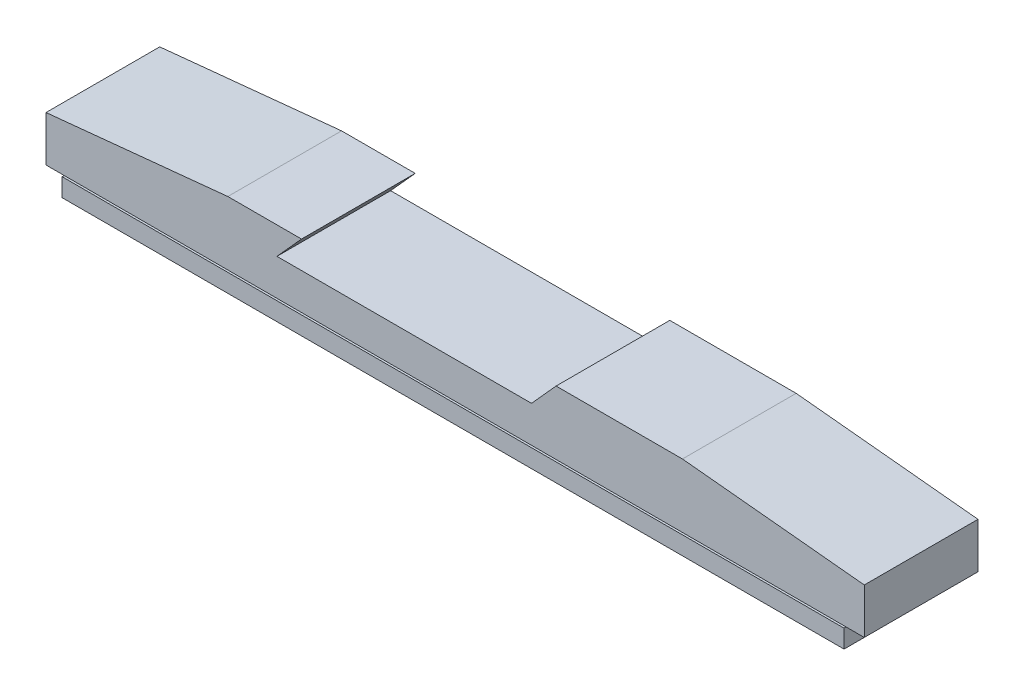
ISO-10303-21;
HEADER;
FILE_DESCRIPTION(('STEP AP214'),'2;1');
FILE_NAME('part.step','',(''),(''),'','','');
FILE_SCHEMA(('AUTOMOTIVE_DESIGN { 1 0 10303 214 1 1 1 1 }'));
ENDSEC;
DATA;
#1=APPLICATION_CONTEXT('core data for automotive mechanical design processes');
#2=APPLICATION_PROTOCOL_DEFINITION('international standard','automotive_design',2000,#1);
#3=PRODUCT_CONTEXT('',#1,'mechanical');
#4=PRODUCT('Part','Part','',(#3));
#5=PRODUCT_RELATED_PRODUCT_CATEGORY('part','',(#4));
#6=PRODUCT_DEFINITION_FORMATION('','',#4);
#7=PRODUCT_DEFINITION_CONTEXT('part definition',#1,'design');
#8=PRODUCT_DEFINITION('design','',#6,#7);
#9=PRODUCT_DEFINITION_SHAPE('','',#8);
#10=(LENGTH_UNIT() NAMED_UNIT(*) SI_UNIT(.MILLI.,.METRE.));
#11=(NAMED_UNIT(*) PLANE_ANGLE_UNIT() SI_UNIT($,.RADIAN.));
#12=(NAMED_UNIT(*) SI_UNIT($,.STERADIAN.) SOLID_ANGLE_UNIT());
#13=UNCERTAINTY_MEASURE_WITH_UNIT(LENGTH_MEASURE(1.E-05),#10,'distance_accuracy_value','');
#14=(GEOMETRIC_REPRESENTATION_CONTEXT(3) GLOBAL_UNCERTAINTY_ASSIGNED_CONTEXT((#13)) GLOBAL_UNIT_ASSIGNED_CONTEXT((#10,
#11,#12)) REPRESENTATION_CONTEXT('',''));
#15=CARTESIAN_POINT('',(0.,0.,0.));
#16=DIRECTION('',(0.,0.,1.));
#17=DIRECTION('',(1.,0.,0.));
#18=AXIS2_PLACEMENT_3D('',#15,#16,#17);
#19=CARTESIAN_POINT('',(0.,0.,0.));
#20=DIRECTION('',(1.,0.,0.));
#21=DIRECTION('',(0.,0.,-1.));
#22=AXIS2_PLACEMENT_3D('',#19,#20,#21);
#23=PLANE('',#22);
#24=DIRECTION('',(0.,0.,1.));
#25=VECTOR('',#24,1.);
#26=CARTESIAN_POINT('',(0.,25.,-31.2676666666667));
#27=LINE('',#26,#25);
#28=CARTESIAN_POINT('',(0.,25.,-31.2666666666667));
#29=VERTEX_POINT('',#28);
#30=CARTESIAN_POINT('',(0.,25.,31.2666666666667));
#31=VERTEX_POINT('',#30);
#32=EDGE_CURVE('E173',#29,#31,#27,.T.);
#33=ORIENTED_EDGE('',*,*,#32,.F.);
#34=DIRECTION('',(0.,-1.,0.));
#35=VECTOR('',#34,1.);
#36=CARTESIAN_POINT('',(0.,0.,-31.2666666666667));
#37=LINE('',#36,#35);
#38=CARTESIAN_POINT('',(0.,0.,-31.2666666666667));
#39=VERTEX_POINT('',#38);
#40=EDGE_CURVE('E183',#29,#39,#37,.T.);
#41=ORIENTED_EDGE('',*,*,#40,.T.);
#42=DIRECTION('',(0.,0.,-1.));
#43=VECTOR('',#42,1.);
#44=CARTESIAN_POINT('',(0.,0.,0.));
#45=LINE('',#44,#43);
#46=CARTESIAN_POINT('',(0.,0.,-11.6666666666667));
#47=VERTEX_POINT('',#46);
#48=EDGE_CURVE('E287',#47,#39,#45,.T.);
#49=ORIENTED_EDGE('',*,*,#48,.F.);
#50=DIRECTION('',(0.,-1.,0.));
#51=VECTOR('',#50,1.);
#52=CARTESIAN_POINT('',(0.,0.,-11.6666666666667));
#53=LINE('',#52,#51);
#54=CARTESIAN_POINT('',(0.,-10.,-11.6666666666667));
#55=VERTEX_POINT('',#54);
#56=EDGE_CURVE('E206',#47,#55,#53,.T.);
#57=ORIENTED_EDGE('',*,*,#56,.T.);
#58=DIRECTION('',(0.,0.,-1.));
#59=VECTOR('',#58,1.);
#60=CARTESIAN_POINT('',(0.,-10.,0.));
#61=LINE('',#60,#59);
#62=CARTESIAN_POINT('',(0.,-9.99999999999999,-22.4));
#63=VERTEX_POINT('',#62);
#64=EDGE_CURVE('E236',#55,#63,#61,.T.);
#65=ORIENTED_EDGE('',*,*,#64,.T.);
#66=DIRECTION('',(0.,-1.,0.));
#67=VECTOR('',#66,1.);
#68=CARTESIAN_POINT('',(0.,0.,-22.4));
#69=LINE('',#68,#67);
#70=CARTESIAN_POINT('',(0.,-20.,-22.4));
#71=VERTEX_POINT('',#70);
#72=EDGE_CURVE('E232',#63,#71,#69,.T.);
#73=ORIENTED_EDGE('',*,*,#72,.T.);
#74=DIRECTION('',(0.,0.,-1.));
#75=VECTOR('',#74,1.);
#76=CARTESIAN_POINT('',(0.,-20.,0.));
#77=LINE('',#76,#75);
#78=CARTESIAN_POINT('',(0.,-20.,22.4));
#79=VERTEX_POINT('',#78);
#80=EDGE_CURVE('E231',#79,#71,#77,.T.);
#81=ORIENTED_EDGE('',*,*,#80,.F.);
#82=DIRECTION('',(0.,-1.,0.));
#83=VECTOR('',#82,1.);
#84=CARTESIAN_POINT('',(0.,0.,22.4));
#85=LINE('',#84,#83);
#86=CARTESIAN_POINT('',(0.,-10.,22.4));
#87=VERTEX_POINT('',#86);
#88=EDGE_CURVE('E228',#87,#79,#85,.T.);
#89=ORIENTED_EDGE('',*,*,#88,.F.);
#90=DIRECTION('',(0.,0.,-1.));
#91=VECTOR('',#90,1.);
#92=CARTESIAN_POINT('',(0.,-10.,0.));
#93=LINE('',#92,#91);
#94=CARTESIAN_POINT('',(0.,-10.,11.6666666666667));
#95=VERTEX_POINT('',#94);
#96=EDGE_CURVE('E230',#87,#95,#93,.T.);
#97=ORIENTED_EDGE('',*,*,#96,.T.);
#98=DIRECTION('',(0.,-1.,0.));
#99=VECTOR('',#98,1.);
#100=CARTESIAN_POINT('',(0.,0.,11.6666666666667));
#101=LINE('',#100,#99);
#102=CARTESIAN_POINT('',(0.,0.,11.6666666666667));
#103=VERTEX_POINT('',#102);
#104=EDGE_CURVE('E203',#103,#95,#101,.T.);
#105=ORIENTED_EDGE('',*,*,#104,.F.);
#106=CARTESIAN_POINT('',(0.,0.,31.2666666666667));
#107=VERTEX_POINT('',#106);
#108=EDGE_CURVE('E283',#107,#103,#45,.T.);
#109=ORIENTED_EDGE('',*,*,#108,.F.);
#110=DIRECTION('',(0.,-1.,0.));
#111=VECTOR('',#110,1.);
#112=CARTESIAN_POINT('',(0.,0.,31.2666666666667));
#113=LINE('',#112,#111);
#114=EDGE_CURVE('E295',#31,#107,#113,.T.);
#115=ORIENTED_EDGE('',*,*,#114,.F.);
#116=EDGE_LOOP('',(#33,#41,#49,#57,#65,#73,#81,#89,#97,#105,#109,#115));
#117=FACE_BOUND('',#116,.T.);
#118=ADVANCED_FACE('F37',(#117),#23,.F.);
#119=CARTESIAN_POINT('',(450.,35.,0.));
#120=DIRECTION('',(0.,1.,0.));
#121=DIRECTION('',(0.,0.,1.));
#122=AXIS2_PLACEMENT_3D('',#119,#120,#121);
#123=PLANE('',#122);
#124=DIRECTION('',(-1.,0.,0.));
#125=VECTOR('',#124,1.);
#126=CARTESIAN_POINT('',(450.,35.,-31.2666666666667));
#127=LINE('',#126,#125);
#128=CARTESIAN_POINT('',(140.506060664468,35.,-31.2666666666667));
#129=VERTEX_POINT('',#128);
#130=CARTESIAN_POINT('',(100.,35.,-31.2666666666667));
#131=VERTEX_POINT('',#130);
#132=EDGE_CURVE('E181',#129,#131,#127,.T.);
#133=ORIENTED_EDGE('',*,*,#132,.T.);
#134=DIRECTION('',(0.,0.,1.));
#135=VECTOR('',#134,1.);
#136=CARTESIAN_POINT('',(100.,35.,-31.2676666666667));
#137=LINE('',#136,#135);
#138=CARTESIAN_POINT('',(100.,35.,31.2666666666667));
#139=VERTEX_POINT('',#138);
#140=EDGE_CURVE('E163',#131,#139,#137,.T.);
#141=ORIENTED_EDGE('',*,*,#140,.T.);
#142=DIRECTION('',(-1.,0.,0.));
#143=VECTOR('',#142,1.);
#144=CARTESIAN_POINT('',(450.,35.,31.2666666666667));
#145=LINE('',#144,#143);
#146=CARTESIAN_POINT('',(140.506060664468,35.,31.2666666666667));
#147=VERTEX_POINT('',#146);
#148=EDGE_CURVE('E198',#147,#139,#145,.T.);
#149=ORIENTED_EDGE('',*,*,#148,.F.);
#150=DIRECTION('',(0.,0.,1.));
#151=VECTOR('',#150,1.);
#152=CARTESIAN_POINT('',(140.506060664468,35.,-31.2676666666667));
#153=LINE('',#152,#151);
#154=EDGE_CURVE('E186',#129,#147,#153,.T.);
#155=ORIENTED_EDGE('',*,*,#154,.F.);
#156=EDGE_LOOP('',(#133,#141,#149,#155));
#157=FACE_BOUND('',#156,.T.);
#158=ADVANCED_FACE('F189',(#157),#123,.T.);
#159=DIRECTION('',(0.,0.,1.));
#160=VECTOR('',#159,1.);
#161=CARTESIAN_POINT('',(350.,35.,-31.2676666666667));
#162=LINE('',#161,#160);
#163=CARTESIAN_POINT('',(350.,35.,-31.2666666666667));
#164=VERTEX_POINT('',#163);
#165=CARTESIAN_POINT('',(350.,35.,31.2666666666667));
#166=VERTEX_POINT('',#165);
#167=EDGE_CURVE('E332',#164,#166,#162,.T.);
#168=ORIENTED_EDGE('',*,*,#167,.F.);
#169=CARTESIAN_POINT('',(280.506060664468,35.,-31.2666666666667));
#170=VERTEX_POINT('',#169);
#171=EDGE_CURVE('E188',#164,#170,#127,.T.);
#172=ORIENTED_EDGE('',*,*,#171,.T.);
#173=DIRECTION('',(0.,0.,1.));
#174=VECTOR('',#173,1.);
#175=CARTESIAN_POINT('',(280.506060664468,35.,-31.2676666666667));
#176=LINE('',#175,#174);
#177=CARTESIAN_POINT('',(280.506060664468,35.,31.2666666666667));
#178=VERTEX_POINT('',#177);
#179=EDGE_CURVE('E314',#170,#178,#176,.T.);
#180=ORIENTED_EDGE('',*,*,#179,.T.);
#181=EDGE_CURVE('E194',#166,#178,#145,.T.);
#182=ORIENTED_EDGE('',*,*,#181,.F.);
#183=EDGE_LOOP('',(#168,#172,#180,#182));
#184=FACE_BOUND('',#183,.T.);
#185=ADVANCED_FACE('F349',(#184),#123,.T.);
#186=CARTESIAN_POINT('',(450.,0.,0.));
#187=DIRECTION('',(1.,0.,0.));
#188=DIRECTION('',(0.,0.,-1.));
#189=AXIS2_PLACEMENT_3D('',#186,#187,#188);
#190=PLANE('',#189);
#191=DIRECTION('',(0.,-1.,0.));
#192=VECTOR('',#191,1.);
#193=CARTESIAN_POINT('',(450.,0.,-31.2666666666667));
#194=LINE('',#193,#192);
#195=CARTESIAN_POINT('',(450.,25.,-31.2666666666667));
#196=VERTEX_POINT('',#195);
#197=CARTESIAN_POINT('',(450.,0.,-31.2666666666667));
#198=VERTEX_POINT('',#197);
#199=EDGE_CURVE('E304',#196,#198,#194,.T.);
#200=ORIENTED_EDGE('',*,*,#199,.F.);
#201=DIRECTION('',(0.,0.,1.));
#202=VECTOR('',#201,1.);
#203=CARTESIAN_POINT('',(450.,25.,-31.2676666666667));
#204=LINE('',#203,#202);
#205=CARTESIAN_POINT('',(450.,25.,31.2666666666667));
#206=VERTEX_POINT('',#205);
#207=EDGE_CURVE('E335',#196,#206,#204,.T.);
#208=ORIENTED_EDGE('',*,*,#207,.T.);
#209=DIRECTION('',(0.,-1.,0.));
#210=VECTOR('',#209,1.);
#211=CARTESIAN_POINT('',(450.,0.,31.2666666666667));
#212=LINE('',#211,#210);
#213=CARTESIAN_POINT('',(450.,0.,31.2666666666667));
#214=VERTEX_POINT('',#213);
#215=EDGE_CURVE('E300',#206,#214,#212,.T.);
#216=ORIENTED_EDGE('',*,*,#215,.T.);
#217=DIRECTION('',(0.,0.,-1.));
#218=VECTOR('',#217,1.);
#219=CARTESIAN_POINT('',(450.,0.,0.));
#220=LINE('',#219,#218);
#221=EDGE_CURVE('E298',#214,#198,#220,.T.);
#222=ORIENTED_EDGE('',*,*,#221,.T.);
#223=EDGE_LOOP('',(#200,#208,#216,#222));
#224=FACE_BOUND('',#223,.T.);
#225=ADVANCED_FACE('F354',(#224),#190,.T.);
#226=CARTESIAN_POINT('',(450.,0.,-31.2666666666667));
#227=DIRECTION('',(0.,0.,-1.));
#228=DIRECTION('',(-1.,0.,0.));
#229=AXIS2_PLACEMENT_3D('',#226,#227,#228);
#230=PLANE('',#229);
#231=ORIENTED_EDGE('',*,*,#171,.F.);
#232=DIRECTION('',(0.995037190209989,-0.0995037190209991,0.));
#233=VECTOR('',#232,1.);
#234=CARTESIAN_POINT('',(6.93069306930695,69.3069306930694,-31.2666666666667));
#235=LINE('',#234,#233);
#236=EDGE_CURVE('E331',#164,#196,#235,.T.);
#237=ORIENTED_EDGE('',*,*,#236,.T.);
#238=ORIENTED_EDGE('',*,*,#199,.T.);
#239=DIRECTION('',(-1.,0.,0.));
#240=VECTOR('',#239,1.);
#241=CARTESIAN_POINT('',(450.,0.,-31.2666666666667));
#242=LINE('',#241,#240);
#243=EDGE_CURVE('E193',#198,#39,#242,.T.);
#244=ORIENTED_EDGE('',*,*,#243,.T.);
#245=ORIENTED_EDGE('',*,*,#40,.F.);
#246=DIRECTION('',(0.995037190209989,0.0995037190209991,0.));
#247=VECTOR('',#246,1.);
#248=CARTESIAN_POINT('',(-2.47524752475248,24.7524752475248,-31.2666666666667));
#249=LINE('',#248,#247);
#250=EDGE_CURVE('E170',#29,#131,#249,.T.);
#251=ORIENTED_EDGE('',*,*,#250,.T.);
#252=ORIENTED_EDGE('',*,*,#132,.F.);
#253=DIRECTION('',(-0.669130606358862,-0.743144825477391,0.));
#254=VECTOR('',#253,1.);
#255=CARTESIAN_POINT('',(60.1923384638127,-54.1974249885619,-31.2666666666667));
#256=LINE('',#255,#254);
#257=CARTESIAN_POINT('',(127.,20.,-31.2666666666667));
#258=VERTEX_POINT('',#257);
#259=EDGE_CURVE('E324',#129,#258,#256,.T.);
#260=ORIENTED_EDGE('',*,*,#259,.T.);
#261=DIRECTION('',(1.,0.,0.));
#262=VECTOR('',#261,1.);
#263=CARTESIAN_POINT('',(0.,20.,-31.2666666666667));
#264=LINE('',#263,#262);
#265=CARTESIAN_POINT('',(267.,20.,-31.2666666666667));
#266=VERTEX_POINT('',#265);
#267=EDGE_CURVE('E330',#258,#266,#264,.T.);
#268=ORIENTED_EDGE('',*,*,#267,.T.);
#269=DIRECTION('',(0.669130606358862,0.743144825477391,0.));
#270=VECTOR('',#269,1.);
#271=CARTESIAN_POINT('',(137.509330892548,-123.813957664341,-31.2666666666667));
#272=LINE('',#271,#270);
#273=EDGE_CURVE('E293',#266,#170,#272,.T.);
#274=ORIENTED_EDGE('',*,*,#273,.T.);
#275=EDGE_LOOP('',(#231,#237,#238,#244,#245,#251,#252,#260,#268,#274));
#276=FACE_BOUND('',#275,.T.);
#277=ADVANCED_FACE('F182',(#276),#230,.T.);
#278=CARTESIAN_POINT('',(450.,0.,31.2666666666667));
#279=DIRECTION('',(0.,0.,-1.));
#280=DIRECTION('',(-1.,0.,0.));
#281=AXIS2_PLACEMENT_3D('',#278,#279,#280);
#282=PLANE('',#281);
#283=DIRECTION('',(0.995037190209989,-0.0995037190209991,0.));
#284=VECTOR('',#283,1.);
#285=CARTESIAN_POINT('',(6.93069306930695,69.3069306930694,31.2666666666667));
#286=LINE('',#285,#284);
#287=EDGE_CURVE('E64',#166,#206,#286,.T.);
#288=ORIENTED_EDGE('',*,*,#287,.F.);
#289=ORIENTED_EDGE('',*,*,#181,.T.);
#290=DIRECTION('',(0.669130606358862,0.743144825477391,0.));
#291=VECTOR('',#290,1.);
#292=CARTESIAN_POINT('',(137.509330892548,-123.813957664341,31.2666666666667));
#293=LINE('',#292,#291);
#294=CARTESIAN_POINT('',(267.,20.,31.2666666666667));
#295=VERTEX_POINT('',#294);
#296=EDGE_CURVE('E319',#295,#178,#293,.T.);
#297=ORIENTED_EDGE('',*,*,#296,.F.);
#298=DIRECTION('',(1.,0.,0.));
#299=VECTOR('',#298,1.);
#300=CARTESIAN_POINT('',(0.,20.,31.2666666666667));
#301=LINE('',#300,#299);
#302=CARTESIAN_POINT('',(127.,20.,31.2666666666667));
#303=VERTEX_POINT('',#302);
#304=EDGE_CURVE('E325',#303,#295,#301,.T.);
#305=ORIENTED_EDGE('',*,*,#304,.F.);
#306=DIRECTION('',(-0.669130606358862,-0.743144825477391,0.));
#307=VECTOR('',#306,1.);
#308=CARTESIAN_POINT('',(60.1923384638127,-54.1974249885619,31.2666666666667));
#309=LINE('',#308,#307);
#310=EDGE_CURVE('E54',#147,#303,#309,.T.);
#311=ORIENTED_EDGE('',*,*,#310,.F.);
#312=ORIENTED_EDGE('',*,*,#148,.T.);
#313=DIRECTION('',(0.995037190209989,0.0995037190209991,0.));
#314=VECTOR('',#313,1.);
#315=CARTESIAN_POINT('',(-2.47524752475248,24.7524752475248,31.2666666666667));
#316=LINE('',#315,#314);
#317=EDGE_CURVE('E168',#31,#139,#316,.T.);
#318=ORIENTED_EDGE('',*,*,#317,.F.);
#319=ORIENTED_EDGE('',*,*,#114,.T.);
#320=DIRECTION('',(-1.,0.,0.));
#321=VECTOR('',#320,1.);
#322=CARTESIAN_POINT('',(450.,0.,31.2666666666667));
#323=LINE('',#322,#321);
#324=EDGE_CURVE('E290',#214,#107,#323,.T.);
#325=ORIENTED_EDGE('',*,*,#324,.F.);
#326=ORIENTED_EDGE('',*,*,#215,.F.);
#327=EDGE_LOOP('',(#288,#289,#297,#305,#311,#312,#318,#319,#325,#326));
#328=FACE_BOUND('',#327,.T.);
#329=ADVANCED_FACE('F336',(#328),#282,.F.);
#330=CARTESIAN_POINT('',(430.,0.,11.6666666666667));
#331=DIRECTION('',(0.,0.,-1.));
#332=DIRECTION('',(-1.,0.,0.));
#333=AXIS2_PLACEMENT_3D('',#330,#331,#332);
#334=PLANE('',#333);
#335=ORIENTED_EDGE('',*,*,#104,.T.);
#336=DIRECTION('',(-1.,0.,0.));
#337=VECTOR('',#336,1.);
#338=CARTESIAN_POINT('',(430.,-10.,11.6666666666667));
#339=LINE('',#338,#337);
#340=CARTESIAN_POINT('',(430.,-10.,11.6666666666667));
#341=VERTEX_POINT('',#340);
#342=EDGE_CURVE('E48',#341,#95,#339,.T.);
#343=ORIENTED_EDGE('',*,*,#342,.F.);
#344=DIRECTION('',(0.,-1.,0.));
#345=VECTOR('',#344,1.);
#346=CARTESIAN_POINT('',(430.,0.,11.6666666666667));
#347=LINE('',#346,#345);
#348=CARTESIAN_POINT('',(430.,0.,11.6666666666667));
#349=VERTEX_POINT('',#348);
#350=EDGE_CURVE('E202',#349,#341,#347,.T.);
#351=ORIENTED_EDGE('',*,*,#350,.F.);
#352=DIRECTION('',(-1.,0.,0.));
#353=VECTOR('',#352,1.);
#354=CARTESIAN_POINT('',(430.,0.,11.6666666666667));
#355=LINE('',#354,#353);
#356=EDGE_CURVE('E12',#349,#103,#355,.T.);
#357=ORIENTED_EDGE('',*,*,#356,.T.);
#358=EDGE_LOOP('',(#335,#343,#351,#357));
#359=FACE_BOUND('',#358,.T.);
#360=ADVANCED_FACE('F45',(#359),#334,.F.);
#361=CARTESIAN_POINT('',(430.,-10.,0.));
#362=DIRECTION('',(0.,1.,0.));
#363=DIRECTION('',(0.,0.,1.));
#364=AXIS2_PLACEMENT_3D('',#361,#362,#363);
#365=PLANE('',#364);
#366=ORIENTED_EDGE('',*,*,#96,.F.);
#367=DIRECTION('',(-1.,0.,0.));
#368=VECTOR('',#367,1.);
#369=CARTESIAN_POINT('',(430.,-10.,22.4));
#370=LINE('',#369,#368);
#371=CARTESIAN_POINT('',(430.,-10.,22.4));
#372=VERTEX_POINT('',#371);
#373=EDGE_CURVE('E255',#372,#87,#370,.T.);
#374=ORIENTED_EDGE('',*,*,#373,.F.);
#375=DIRECTION('',(0.,0.,-1.));
#376=VECTOR('',#375,1.);
#377=CARTESIAN_POINT('',(430.,-10.,0.));
#378=LINE('',#377,#376);
#379=EDGE_CURVE('E208',#372,#341,#378,.T.);
#380=ORIENTED_EDGE('',*,*,#379,.T.);
#381=ORIENTED_EDGE('',*,*,#342,.T.);
#382=EDGE_LOOP('',(#366,#374,#380,#381));
#383=FACE_BOUND('',#382,.T.);
#384=ADVANCED_FACE('F256',(#383),#365,.T.);
#385=CARTESIAN_POINT('',(430.,0.,22.4));
#386=DIRECTION('',(0.,0.,-1.));
#387=DIRECTION('',(0.,1.,0.));
#388=AXIS2_PLACEMENT_3D('',#385,#386,#387);
#389=PLANE('',#388);
#390=ORIENTED_EDGE('',*,*,#88,.T.);
#391=DIRECTION('',(-1.,0.,0.));
#392=VECTOR('',#391,1.);
#393=CARTESIAN_POINT('',(430.,-20.,22.4));
#394=LINE('',#393,#392);
#395=CARTESIAN_POINT('',(430.,-20.,22.4));
#396=VERTEX_POINT('',#395);
#397=EDGE_CURVE('E253',#396,#79,#394,.T.);
#398=ORIENTED_EDGE('',*,*,#397,.F.);
#399=DIRECTION('',(0.,-1.,0.));
#400=VECTOR('',#399,1.);
#401=CARTESIAN_POINT('',(430.,0.,22.4));
#402=LINE('',#401,#400);
#403=EDGE_CURVE('E211',#372,#396,#402,.T.);
#404=ORIENTED_EDGE('',*,*,#403,.F.);
#405=ORIENTED_EDGE('',*,*,#373,.T.);
#406=EDGE_LOOP('',(#390,#398,#404,#405));
#407=FACE_BOUND('',#406,.T.);
#408=ADVANCED_FACE('F269',(#407),#389,.F.);
#409=CARTESIAN_POINT('',(430.,-20.,0.));
#410=DIRECTION('',(0.,1.,0.));
#411=DIRECTION('',(0.,0.,1.));
#412=AXIS2_PLACEMENT_3D('',#409,#410,#411);
#413=PLANE('',#412);
#414=ORIENTED_EDGE('',*,*,#80,.T.);
#415=DIRECTION('',(-1.,0.,0.));
#416=VECTOR('',#415,1.);
#417=CARTESIAN_POINT('',(430.,-20.,-22.4));
#418=LINE('',#417,#416);
#419=CARTESIAN_POINT('',(430.,-20.,-22.4));
#420=VERTEX_POINT('',#419);
#421=EDGE_CURVE('E248',#420,#71,#418,.T.);
#422=ORIENTED_EDGE('',*,*,#421,.F.);
#423=DIRECTION('',(0.,0.,-1.));
#424=VECTOR('',#423,1.);
#425=CARTESIAN_POINT('',(430.,-20.,0.));
#426=LINE('',#425,#424);
#427=EDGE_CURVE('E213',#396,#420,#426,.T.);
#428=ORIENTED_EDGE('',*,*,#427,.F.);
#429=ORIENTED_EDGE('',*,*,#397,.T.);
#430=EDGE_LOOP('',(#414,#422,#428,#429));
#431=FACE_BOUND('',#430,.T.);
#432=ADVANCED_FACE('F273',(#431),#413,.F.);
#433=CARTESIAN_POINT('',(430.,0.,-22.4));
#434=DIRECTION('',(0.,0.,-1.));
#435=DIRECTION('',(0.,1.,0.));
#436=AXIS2_PLACEMENT_3D('',#433,#434,#435);
#437=PLANE('',#436);
#438=ORIENTED_EDGE('',*,*,#72,.F.);
#439=DIRECTION('',(-1.,0.,0.));
#440=VECTOR('',#439,1.);
#441=CARTESIAN_POINT('',(430.,-9.99999999999999,-22.4));
#442=LINE('',#441,#440);
#443=CARTESIAN_POINT('',(430.,-9.99999999999999,-22.4));
#444=VERTEX_POINT('',#443);
#445=EDGE_CURVE('E246',#444,#63,#442,.T.);
#446=ORIENTED_EDGE('',*,*,#445,.F.);
#447=DIRECTION('',(0.,-1.,0.));
#448=VECTOR('',#447,1.);
#449=CARTESIAN_POINT('',(430.,0.,-22.4));
#450=LINE('',#449,#448);
#451=EDGE_CURVE('E214',#444,#420,#450,.T.);
#452=ORIENTED_EDGE('',*,*,#451,.T.);
#453=ORIENTED_EDGE('',*,*,#421,.T.);
#454=EDGE_LOOP('',(#438,#446,#452,#453));
#455=FACE_BOUND('',#454,.T.);
#456=ADVANCED_FACE('F379',(#455),#437,.T.);
#457=CARTESIAN_POINT('',(430.,-10.,0.));
#458=DIRECTION('',(0.,1.,0.));
#459=DIRECTION('',(0.,0.,1.));
#460=AXIS2_PLACEMENT_3D('',#457,#458,#459);
#461=PLANE('',#460);
#462=ORIENTED_EDGE('',*,*,#64,.F.);
#463=DIRECTION('',(-1.,0.,0.));
#464=VECTOR('',#463,1.);
#465=CARTESIAN_POINT('',(430.,-10.,-11.6666666666667));
#466=LINE('',#465,#464);
#467=CARTESIAN_POINT('',(430.,-10.,-11.6666666666667));
#468=VERTEX_POINT('',#467);
#469=EDGE_CURVE('E243',#468,#55,#466,.T.);
#470=ORIENTED_EDGE('',*,*,#469,.F.);
#471=DIRECTION('',(0.,0.,-1.));
#472=VECTOR('',#471,1.);
#473=CARTESIAN_POINT('',(430.,-10.,0.));
#474=LINE('',#473,#472);
#475=EDGE_CURVE('E217',#468,#444,#474,.T.);
#476=ORIENTED_EDGE('',*,*,#475,.T.);
#477=ORIENTED_EDGE('',*,*,#445,.T.);
#478=EDGE_LOOP('',(#462,#470,#476,#477));
#479=FACE_BOUND('',#478,.T.);
#480=ADVANCED_FACE('F376',(#479),#461,.T.);
#481=CARTESIAN_POINT('',(430.,0.,-11.6666666666667));
#482=DIRECTION('',(0.,0.,-1.));
#483=DIRECTION('',(-1.,0.,0.));
#484=AXIS2_PLACEMENT_3D('',#481,#482,#483);
#485=PLANE('',#484);
#486=ORIENTED_EDGE('',*,*,#56,.F.);
#487=DIRECTION('',(-1.,0.,0.));
#488=VECTOR('',#487,1.);
#489=CARTESIAN_POINT('',(430.,0.,-11.6666666666667));
#490=LINE('',#489,#488);
#491=CARTESIAN_POINT('',(430.,0.,-11.6666666666667));
#492=VERTEX_POINT('',#491);
#493=EDGE_CURVE('E221',#492,#47,#490,.T.);
#494=ORIENTED_EDGE('',*,*,#493,.F.);
#495=DIRECTION('',(0.,-1.,0.));
#496=VECTOR('',#495,1.);
#497=CARTESIAN_POINT('',(430.,0.,-11.6666666666667));
#498=LINE('',#497,#496);
#499=EDGE_CURVE('E222',#492,#468,#498,.T.);
#500=ORIENTED_EDGE('',*,*,#499,.T.);
#501=ORIENTED_EDGE('',*,*,#469,.T.);
#502=EDGE_LOOP('',(#486,#494,#500,#501));
#503=FACE_BOUND('',#502,.T.);
#504=ADVANCED_FACE('F373',(#503),#485,.T.);
#505=CARTESIAN_POINT('',(430.,0.,0.));
#506=DIRECTION('',(1.,0.,0.));
#507=DIRECTION('',(0.,0.,-1.));
#508=AXIS2_PLACEMENT_3D('',#505,#506,#507);
#509=PLANE('',#508);
#510=DIRECTION('',(0.,0.,-1.));
#511=VECTOR('',#510,1.);
#512=CARTESIAN_POINT('',(430.,0.,0.));
#513=LINE('',#512,#511);
#514=EDGE_CURVE('E205',#349,#492,#513,.T.);
#515=ORIENTED_EDGE('',*,*,#514,.F.);
#516=ORIENTED_EDGE('',*,*,#350,.T.);
#517=ORIENTED_EDGE('',*,*,#379,.F.);
#518=ORIENTED_EDGE('',*,*,#403,.T.);
#519=ORIENTED_EDGE('',*,*,#427,.T.);
#520=ORIENTED_EDGE('',*,*,#451,.F.);
#521=ORIENTED_EDGE('',*,*,#475,.F.);
#522=ORIENTED_EDGE('',*,*,#499,.F.);
#523=EDGE_LOOP('',(#515,#516,#517,#518,#519,#520,#521,#522));
#524=FACE_BOUND('',#523,.T.);
#525=ADVANCED_FACE('F276',(#524),#509,.T.);
#526=CARTESIAN_POINT('',(450.,0.,0.));
#527=DIRECTION('',(0.,1.,0.));
#528=DIRECTION('',(0.,0.,1.));
#529=AXIS2_PLACEMENT_3D('',#526,#527,#528);
#530=PLANE('',#529);
#531=ORIENTED_EDGE('',*,*,#356,.F.);
#532=ORIENTED_EDGE('',*,*,#514,.T.);
#533=ORIENTED_EDGE('',*,*,#493,.T.);
#534=ORIENTED_EDGE('',*,*,#48,.T.);
#535=ORIENTED_EDGE('',*,*,#243,.F.);
#536=ORIENTED_EDGE('',*,*,#221,.F.);
#537=ORIENTED_EDGE('',*,*,#324,.T.);
#538=ORIENTED_EDGE('',*,*,#108,.T.);
#539=EDGE_LOOP('',(#531,#532,#533,#534,#535,#536,#537,#538));
#540=FACE_BOUND('',#539,.T.);
#541=ADVANCED_FACE('F284',(#540),#530,.F.);
#542=CARTESIAN_POINT('',(0.,20.,-31.2676666666667));
#543=DIRECTION('',(0.,-1.,0.));
#544=DIRECTION('',(0.,0.,-1.));
#545=AXIS2_PLACEMENT_3D('',#542,#543,#544);
#546=PLANE('',#545);
#547=DIRECTION('',(0.,0.,1.));
#548=VECTOR('',#547,1.);
#549=CARTESIAN_POINT('',(127.,20.,-31.2676666666667));
#550=LINE('',#549,#548);
#551=EDGE_CURVE('E313',#258,#303,#550,.T.);
#552=ORIENTED_EDGE('',*,*,#551,.T.);
#553=ORIENTED_EDGE('',*,*,#304,.T.);
#554=DIRECTION('',(0.,0.,1.));
#555=VECTOR('',#554,1.);
#556=CARTESIAN_POINT('',(267.,20.,-31.2676666666667));
#557=LINE('',#556,#555);
#558=EDGE_CURVE('E315',#266,#295,#557,.T.);
#559=ORIENTED_EDGE('',*,*,#558,.F.);
#560=ORIENTED_EDGE('',*,*,#267,.F.);
#561=EDGE_LOOP('',(#552,#553,#559,#560));
#562=FACE_BOUND('',#561,.T.);
#563=ADVANCED_FACE('F343',(#562),#546,.F.);
#564=CARTESIAN_POINT('',(60.1923384638127,-54.1974249885619,-31.2676666666667));
#565=DIRECTION('',(-0.743144825477391,0.669130606358862,0.));
#566=DIRECTION('',(-0.669130606358862,-0.743144825477391,0.));
#567=AXIS2_PLACEMENT_3D('',#564,#565,#566);
#568=PLANE('',#567);
#569=ORIENTED_EDGE('',*,*,#154,.T.);
#570=ORIENTED_EDGE('',*,*,#310,.T.);
#571=ORIENTED_EDGE('',*,*,#551,.F.);
#572=ORIENTED_EDGE('',*,*,#259,.F.);
#573=EDGE_LOOP('',(#569,#570,#571,#572));
#574=FACE_BOUND('',#573,.T.);
#575=ADVANCED_FACE('F342',(#574),#568,.F.);
#576=CARTESIAN_POINT('',(137.509330892548,-123.813957664341,-31.2676666666667));
#577=DIRECTION('',(0.743144825477391,-0.669130606358862,0.));
#578=DIRECTION('',(0.669130606358862,0.743144825477391,0.));
#579=AXIS2_PLACEMENT_3D('',#576,#577,#578);
#580=PLANE('',#579);
#581=ORIENTED_EDGE('',*,*,#558,.T.);
#582=ORIENTED_EDGE('',*,*,#296,.T.);
#583=ORIENTED_EDGE('',*,*,#179,.F.);
#584=ORIENTED_EDGE('',*,*,#273,.F.);
#585=EDGE_LOOP('',(#581,#582,#583,#584));
#586=FACE_BOUND('',#585,.T.);
#587=ADVANCED_FACE('F466',(#586),#580,.F.);
#588=CARTESIAN_POINT('',(6.93069306930695,69.3069306930694,-31.2676666666667));
#589=DIRECTION('',(-0.0995037190209991,-0.995037190209989,0.));
#590=DIRECTION('',(0.995037190209989,-0.0995037190209991,0.));
#591=AXIS2_PLACEMENT_3D('',#588,#589,#590);
#592=PLANE('',#591);
#593=ORIENTED_EDGE('',*,*,#167,.T.);
#594=ORIENTED_EDGE('',*,*,#287,.T.);
#595=ORIENTED_EDGE('',*,*,#207,.F.);
#596=ORIENTED_EDGE('',*,*,#236,.F.);
#597=EDGE_LOOP('',(#593,#594,#595,#596));
#598=FACE_BOUND('',#597,.T.);
#599=ADVANCED_FACE('F352',(#598),#592,.F.);
#600=CARTESIAN_POINT('',(-2.47524752475248,24.7524752475248,-31.2676666666667));
#601=DIRECTION('',(0.0995037190209991,-0.995037190209989,0.));
#602=DIRECTION('',(0.995037190209989,0.0995037190209991,0.));
#603=AXIS2_PLACEMENT_3D('',#600,#601,#602);
#604=PLANE('',#603);
#605=ORIENTED_EDGE('',*,*,#32,.T.);
#606=ORIENTED_EDGE('',*,*,#317,.T.);
#607=ORIENTED_EDGE('',*,*,#140,.F.);
#608=ORIENTED_EDGE('',*,*,#250,.F.);
#609=EDGE_LOOP('',(#605,#606,#607,#608));
#610=FACE_BOUND('',#609,.T.);
#611=ADVANCED_FACE('F167',(#610),#604,.F.);
#612=CLOSED_SHELL('',(#118,#158,#185,#225,#277,#329,#360,#384,#408,#432,#456,#480,#504,#525,
#541,#563,#575,#587,#599,#611));
#613=MANIFOLD_SOLID_BREP('B2',#612);
#614=ADVANCED_BREP_SHAPE_REPRESENTATION('',(#18,#613),#14);
#615=SHAPE_DEFINITION_REPRESENTATION(#9,#614);
ENDSEC;
END-ISO-10303-21;
